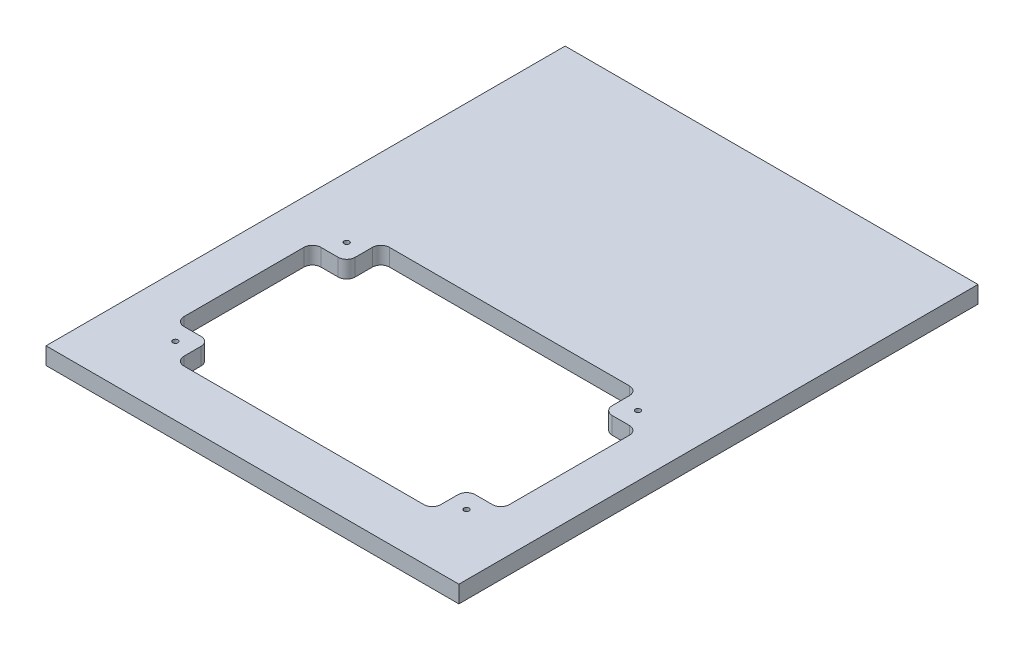
ISO-10303-21;
HEADER;
FILE_DESCRIPTION(('STEP AP214'),'2;1');
FILE_NAME('part.step','',(''),(''),'','','');
FILE_SCHEMA(('AUTOMOTIVE_DESIGN { 1 0 10303 214 1 1 1 1 }'));
ENDSEC;
DATA;
#1=APPLICATION_CONTEXT('core data for automotive mechanical design processes');
#2=APPLICATION_PROTOCOL_DEFINITION('international standard','automotive_design',2000,#1);
#3=PRODUCT_CONTEXT('',#1,'mechanical');
#4=PRODUCT('Part','Part','',(#3));
#5=PRODUCT_RELATED_PRODUCT_CATEGORY('part','',(#4));
#6=PRODUCT_DEFINITION_FORMATION('','',#4);
#7=PRODUCT_DEFINITION_CONTEXT('part definition',#1,'design');
#8=PRODUCT_DEFINITION('design','',#6,#7);
#9=PRODUCT_DEFINITION_SHAPE('','',#8);
#10=(LENGTH_UNIT() NAMED_UNIT(*) SI_UNIT(.MILLI.,.METRE.));
#11=(NAMED_UNIT(*) PLANE_ANGLE_UNIT() SI_UNIT($,.RADIAN.));
#12=(NAMED_UNIT(*) SI_UNIT($,.STERADIAN.) SOLID_ANGLE_UNIT());
#13=UNCERTAINTY_MEASURE_WITH_UNIT(LENGTH_MEASURE(1.E-05),#10,'distance_accuracy_value','');
#14=(GEOMETRIC_REPRESENTATION_CONTEXT(3) GLOBAL_UNCERTAINTY_ASSIGNED_CONTEXT((#13)) GLOBAL_UNIT_ASSIGNED_CONTEXT((#10,
#11,#12)) REPRESENTATION_CONTEXT('',''));
#15=CARTESIAN_POINT('',(0.,0.,0.));
#16=DIRECTION('',(0.,0.,1.));
#17=DIRECTION('',(1.,0.,0.));
#18=AXIS2_PLACEMENT_3D('',#15,#16,#17);
#19=CARTESIAN_POINT('',(0.,10.,0.));
#20=DIRECTION('',(1.,0.,0.));
#21=DIRECTION('',(0.,0.,-1.));
#22=AXIS2_PLACEMENT_3D('',#19,#20,#21);
#23=PLANE('',#22);
#24=DIRECTION('',(0.,0.,1.));
#25=VECTOR('',#24,1.);
#26=CARTESIAN_POINT('',(0.,0.,0.));
#27=LINE('',#26,#25);
#28=CARTESIAN_POINT('',(-1.11022302462516E-13,0.,-303.));
#29=VERTEX_POINT('',#28);
#30=CARTESIAN_POINT('',(0.,0.,0.));
#31=VERTEX_POINT('',#30);
#32=EDGE_CURVE('E378',#29,#31,#27,.T.);
#33=ORIENTED_EDGE('',*,*,#32,.T.);
#34=DIRECTION('',(0.,-1.,0.));
#35=VECTOR('',#34,1.);
#36=CARTESIAN_POINT('',(0.,10.,0.));
#37=LINE('',#36,#35);
#38=CARTESIAN_POINT('',(0.,10.,0.));
#39=VERTEX_POINT('',#38);
#40=EDGE_CURVE('E11',#39,#31,#37,.T.);
#41=ORIENTED_EDGE('',*,*,#40,.F.);
#42=DIRECTION('',(0.,0.,1.));
#43=VECTOR('',#42,1.);
#44=CARTESIAN_POINT('',(0.,10.,0.));
#45=LINE('',#44,#43);
#46=CARTESIAN_POINT('',(-1.11022302462516E-13,10.,-303.));
#47=VERTEX_POINT('',#46);
#48=EDGE_CURVE('E422',#47,#39,#45,.T.);
#49=ORIENTED_EDGE('',*,*,#48,.F.);
#50=DIRECTION('',(0.,-1.,0.));
#51=VECTOR('',#50,1.);
#52=CARTESIAN_POINT('',(-1.11022302462516E-13,10.,-303.));
#53=LINE('',#52,#51);
#54=EDGE_CURVE('E432',#47,#29,#53,.T.);
#55=ORIENTED_EDGE('',*,*,#54,.T.);
#56=EDGE_LOOP('',(#33,#41,#49,#55));
#57=FACE_BOUND('',#56,.T.);
#58=ADVANCED_FACE('F37',(#57),#23,.F.);
#59=CARTESIAN_POINT('',(0.,10.,0.));
#60=DIRECTION('',(0.,0.,-1.));
#61=DIRECTION('',(-1.,0.,0.));
#62=AXIS2_PLACEMENT_3D('',#59,#60,#61);
#63=PLANE('',#62);
#64=DIRECTION('',(1.,0.,0.));
#65=VECTOR('',#64,1.);
#66=CARTESIAN_POINT('',(0.,0.,0.));
#67=LINE('',#66,#65);
#68=CARTESIAN_POINT('',(241.,0.,0.));
#69=VERTEX_POINT('',#68);
#70=EDGE_CURVE('E435',#31,#69,#67,.T.);
#71=ORIENTED_EDGE('',*,*,#70,.T.);
#72=DIRECTION('',(0.,-1.,0.));
#73=VECTOR('',#72,1.);
#74=CARTESIAN_POINT('',(241.,10.,0.));
#75=LINE('',#74,#73);
#76=CARTESIAN_POINT('',(241.,10.,0.));
#77=VERTEX_POINT('',#76);
#78=EDGE_CURVE('E44',#77,#69,#75,.T.);
#79=ORIENTED_EDGE('',*,*,#78,.F.);
#80=DIRECTION('',(1.,0.,0.));
#81=VECTOR('',#80,1.);
#82=CARTESIAN_POINT('',(0.,10.,0.));
#83=LINE('',#82,#81);
#84=EDGE_CURVE('E425',#39,#77,#83,.T.);
#85=ORIENTED_EDGE('',*,*,#84,.F.);
#86=ORIENTED_EDGE('',*,*,#40,.T.);
#87=EDGE_LOOP('',(#71,#79,#85,#86));
#88=FACE_BOUND('',#87,.T.);
#89=ADVANCED_FACE('F463',(#88),#63,.F.);
#90=CARTESIAN_POINT('',(241.,10.,0.));
#91=DIRECTION('',(-1.,0.,0.));
#92=DIRECTION('',(0.,0.,1.));
#93=AXIS2_PLACEMENT_3D('',#90,#91,#92);
#94=PLANE('',#93);
#95=DIRECTION('',(0.,0.,-1.));
#96=VECTOR('',#95,1.);
#97=CARTESIAN_POINT('',(241.,0.,0.));
#98=LINE('',#97,#96);
#99=CARTESIAN_POINT('',(241.,0.,-303.));
#100=VERTEX_POINT('',#99);
#101=EDGE_CURVE('E437',#69,#100,#98,.T.);
#102=ORIENTED_EDGE('',*,*,#101,.T.);
#103=DIRECTION('',(0.,-1.,0.));
#104=VECTOR('',#103,1.);
#105=CARTESIAN_POINT('',(241.,10.,-303.));
#106=LINE('',#105,#104);
#107=CARTESIAN_POINT('',(241.,10.,-303.));
#108=VERTEX_POINT('',#107);
#109=EDGE_CURVE('E442',#108,#100,#106,.T.);
#110=ORIENTED_EDGE('',*,*,#109,.F.);
#111=DIRECTION('',(0.,0.,-1.));
#112=VECTOR('',#111,1.);
#113=CARTESIAN_POINT('',(241.,10.,0.));
#114=LINE('',#113,#112);
#115=EDGE_CURVE('E428',#77,#108,#114,.T.);
#116=ORIENTED_EDGE('',*,*,#115,.F.);
#117=ORIENTED_EDGE('',*,*,#78,.T.);
#118=EDGE_LOOP('',(#102,#110,#116,#117));
#119=FACE_BOUND('',#118,.T.);
#120=ADVANCED_FACE('F449',(#119),#94,.F.);
#121=CARTESIAN_POINT('',(-1.11022302462516E-13,10.,-303.));
#122=DIRECTION('',(0.,0.,1.));
#123=DIRECTION('',(1.,0.,0.));
#124=AXIS2_PLACEMENT_3D('',#121,#122,#123);
#125=PLANE('',#124);
#126=DIRECTION('',(-1.,0.,0.));
#127=VECTOR('',#126,1.);
#128=CARTESIAN_POINT('',(-1.11022302462516E-13,0.,-303.));
#129=LINE('',#128,#127);
#130=EDGE_CURVE('E426',#100,#29,#129,.T.);
#131=ORIENTED_EDGE('',*,*,#130,.T.);
#132=ORIENTED_EDGE('',*,*,#54,.F.);
#133=DIRECTION('',(-1.,0.,0.));
#134=VECTOR('',#133,1.);
#135=CARTESIAN_POINT('',(-1.11022302462516E-13,10.,-303.));
#136=LINE('',#135,#134);
#137=EDGE_CURVE('E430',#108,#47,#136,.T.);
#138=ORIENTED_EDGE('',*,*,#137,.F.);
#139=ORIENTED_EDGE('',*,*,#109,.T.);
#140=EDGE_LOOP('',(#131,#132,#138,#139));
#141=FACE_BOUND('',#140,.T.);
#142=ADVANCED_FACE('F456',(#141),#125,.F.);
#143=CARTESIAN_POINT('',(0.,10.,0.));
#144=DIRECTION('',(0.,-1.,0.));
#145=DIRECTION('',(0.,0.,-1.));
#146=AXIS2_PLACEMENT_3D('',#143,#144,#145);
#147=PLANE('',#146);
#148=CARTESIAN_POINT('',(205.5,10.,-40.));
#149=DIRECTION('',(0.,1.,0.));
#150=DIRECTION('',(0.,0.,1.));
#151=AXIS2_PLACEMENT_3D('',#148,#149,#150);
#152=CIRCLE('',#151,1.5);
#153=CARTESIAN_POINT('',(205.5,10.,-38.5));
#154=VERTEX_POINT('',#153);
#155=EDGE_CURVE('E607',#154,#154,#152,.T.);
#156=ORIENTED_EDGE('',*,*,#155,.F.);
#157=EDGE_LOOP('',(#156));
#158=FACE_BOUND('',#157,.T.);
#159=CARTESIAN_POINT('',(35.4999999999999,10.,-40.));
#160=DIRECTION('',(0.,1.,0.));
#161=DIRECTION('',(0.,0.,1.));
#162=AXIS2_PLACEMENT_3D('',#159,#160,#161);
#163=CIRCLE('',#162,1.5);
#164=CARTESIAN_POINT('',(35.4999999999999,10.,-38.5));
#165=VERTEX_POINT('',#164);
#166=EDGE_CURVE('E599',#165,#165,#163,.T.);
#167=ORIENTED_EDGE('',*,*,#166,.F.);
#168=EDGE_LOOP('',(#167));
#169=FACE_BOUND('',#168,.T.);
#170=CARTESIAN_POINT('',(35.4999999999999,10.,-140.));
#171=DIRECTION('',(0.,1.,0.));
#172=DIRECTION('',(0.,0.,1.));
#173=AXIS2_PLACEMENT_3D('',#170,#171,#172);
#174=CIRCLE('',#173,1.5);
#175=CARTESIAN_POINT('',(35.4999999999999,10.,-138.5));
#176=VERTEX_POINT('',#175);
#177=EDGE_CURVE('E593',#176,#176,#174,.T.);
#178=ORIENTED_EDGE('',*,*,#177,.F.);
#179=EDGE_LOOP('',(#178));
#180=FACE_BOUND('',#179,.T.);
#181=CARTESIAN_POINT('',(205.5,10.,-140.));
#182=DIRECTION('',(0.,1.,0.));
#183=DIRECTION('',(0.,0.,1.));
#184=AXIS2_PLACEMENT_3D('',#181,#182,#183);
#185=CIRCLE('',#184,1.5);
#186=CARTESIAN_POINT('',(205.5,10.,-138.5));
#187=VERTEX_POINT('',#186);
#188=EDGE_CURVE('E246',#187,#187,#185,.T.);
#189=ORIENTED_EDGE('',*,*,#188,.F.);
#190=EDGE_LOOP('',(#189));
#191=FACE_BOUND('',#190,.T.);
#192=DIRECTION('',(0.,0.,1.));
#193=VECTOR('',#192,1.);
#194=CARTESIAN_POINT('',(45.4999999999999,10.,-145.));
#195=LINE('',#194,#193);
#196=CARTESIAN_POINT('',(45.4999999999999,10.,-145.));
#197=VERTEX_POINT('',#196);
#198=CARTESIAN_POINT('',(45.5,10.,-135.));
#199=VERTEX_POINT('',#198);
#200=EDGE_CURVE('E311',#197,#199,#195,.T.);
#201=ORIENTED_EDGE('',*,*,#200,.F.);
#202=CARTESIAN_POINT('',(50.4999999999999,10.,-145.));
#203=DIRECTION('',(0.,1.,0.));
#204=DIRECTION('',(0.,0.,1.));
#205=AXIS2_PLACEMENT_3D('',#202,#203,#204);
#206=CIRCLE('',#205,5.);
#207=CARTESIAN_POINT('',(50.4999999999999,10.,-150.));
#208=VERTEX_POINT('',#207);
#209=EDGE_CURVE('E51',#208,#197,#206,.T.);
#210=ORIENTED_EDGE('',*,*,#209,.F.);
#211=DIRECTION('',(-1.,0.,0.));
#212=VECTOR('',#211,1.);
#213=CARTESIAN_POINT('',(50.4999999999999,10.,-150.));
#214=LINE('',#213,#212);
#215=CARTESIAN_POINT('',(190.5,10.,-150.));
#216=VERTEX_POINT('',#215);
#217=EDGE_CURVE('E240',#216,#208,#214,.T.);
#218=ORIENTED_EDGE('',*,*,#217,.F.);
#219=CARTESIAN_POINT('',(190.5,10.,-145.));
#220=DIRECTION('',(0.,1.,0.));
#221=DIRECTION('',(0.,0.,-1.));
#222=AXIS2_PLACEMENT_3D('',#219,#220,#221);
#223=CIRCLE('',#222,5.);
#224=CARTESIAN_POINT('',(195.5,10.,-145.));
#225=VERTEX_POINT('',#224);
#226=EDGE_CURVE('E243',#225,#216,#223,.T.);
#227=ORIENTED_EDGE('',*,*,#226,.F.);
#228=DIRECTION('',(0.,0.,-1.));
#229=VECTOR('',#228,1.);
#230=CARTESIAN_POINT('',(195.5,10.,-145.));
#231=LINE('',#230,#229);
#232=CARTESIAN_POINT('',(195.5,10.,-135.));
#233=VERTEX_POINT('',#232);
#234=EDGE_CURVE('E371',#233,#225,#231,.T.);
#235=ORIENTED_EDGE('',*,*,#234,.F.);
#236=CARTESIAN_POINT('',(200.5,10.,-135.));
#237=DIRECTION('',(0.,-1.,0.));
#238=DIRECTION('',(0.,0.,-1.));
#239=AXIS2_PLACEMENT_3D('',#236,#237,#238);
#240=CIRCLE('',#239,5.);
#241=CARTESIAN_POINT('',(200.5,10.,-130.));
#242=VERTEX_POINT('',#241);
#243=EDGE_CURVE('E368',#242,#233,#240,.T.);
#244=ORIENTED_EDGE('',*,*,#243,.F.);
#245=DIRECTION('',(-1.,0.,0.));
#246=VECTOR('',#245,1.);
#247=CARTESIAN_POINT('',(210.5,10.,-130.));
#248=LINE('',#247,#246);
#249=CARTESIAN_POINT('',(210.5,10.,-130.));
#250=VERTEX_POINT('',#249);
#251=EDGE_CURVE('E365',#250,#242,#248,.T.);
#252=ORIENTED_EDGE('',*,*,#251,.F.);
#253=CARTESIAN_POINT('',(210.5,10.,-125.));
#254=DIRECTION('',(0.,1.,0.));
#255=DIRECTION('',(0.,0.,1.));
#256=AXIS2_PLACEMENT_3D('',#253,#254,#255);
#257=CIRCLE('',#256,5.);
#258=CARTESIAN_POINT('',(215.5,10.,-125.));
#259=VERTEX_POINT('',#258);
#260=EDGE_CURVE('E362',#259,#250,#257,.T.);
#261=ORIENTED_EDGE('',*,*,#260,.F.);
#262=DIRECTION('',(0.,0.,-1.));
#263=VECTOR('',#262,1.);
#264=CARTESIAN_POINT('',(215.5,10.,-55.));
#265=LINE('',#264,#263);
#266=CARTESIAN_POINT('',(215.5,10.,-55.));
#267=VERTEX_POINT('',#266);
#268=EDGE_CURVE('E359',#267,#259,#265,.T.);
#269=ORIENTED_EDGE('',*,*,#268,.F.);
#270=CARTESIAN_POINT('',(210.5,10.,-55.));
#271=DIRECTION('',(0.,1.,0.));
#272=DIRECTION('',(0.,0.,1.));
#273=AXIS2_PLACEMENT_3D('',#270,#271,#272);
#274=CIRCLE('',#273,5.);
#275=CARTESIAN_POINT('',(210.5,10.,-50.));
#276=VERTEX_POINT('',#275);
#277=EDGE_CURVE('E356',#276,#267,#274,.T.);
#278=ORIENTED_EDGE('',*,*,#277,.F.);
#279=DIRECTION('',(1.,0.,0.));
#280=VECTOR('',#279,1.);
#281=CARTESIAN_POINT('',(210.5,10.,-50.));
#282=LINE('',#281,#280);
#283=CARTESIAN_POINT('',(200.5,10.,-50.));
#284=VERTEX_POINT('',#283);
#285=EDGE_CURVE('E353',#284,#276,#282,.T.);
#286=ORIENTED_EDGE('',*,*,#285,.F.);
#287=CARTESIAN_POINT('',(200.5,10.,-45.));
#288=DIRECTION('',(0.,-1.,0.));
#289=DIRECTION('',(0.,0.,1.));
#290=AXIS2_PLACEMENT_3D('',#287,#288,#289);
#291=CIRCLE('',#290,5.00000000000002);
#292=CARTESIAN_POINT('',(195.5,10.,-45.));
#293=VERTEX_POINT('',#292);
#294=EDGE_CURVE('E350',#293,#284,#291,.T.);
#295=ORIENTED_EDGE('',*,*,#294,.F.);
#296=DIRECTION('',(0.,0.,-1.));
#297=VECTOR('',#296,1.);
#298=CARTESIAN_POINT('',(195.5,10.,-45.));
#299=LINE('',#298,#297);
#300=CARTESIAN_POINT('',(195.5,10.,-35.));
#301=VERTEX_POINT('',#300);
#302=EDGE_CURVE('E347',#301,#293,#299,.T.);
#303=ORIENTED_EDGE('',*,*,#302,.F.);
#304=CARTESIAN_POINT('',(190.5,10.,-35.));
#305=DIRECTION('',(0.,1.,0.));
#306=DIRECTION('',(0.,0.,1.));
#307=AXIS2_PLACEMENT_3D('',#304,#305,#306);
#308=CIRCLE('',#307,5.);
#309=CARTESIAN_POINT('',(190.5,10.,-30.));
#310=VERTEX_POINT('',#309);
#311=EDGE_CURVE('E344',#310,#301,#308,.T.);
#312=ORIENTED_EDGE('',*,*,#311,.F.);
#313=DIRECTION('',(1.,0.,0.));
#314=VECTOR('',#313,1.);
#315=CARTESIAN_POINT('',(50.4999999999999,10.,-30.));
#316=LINE('',#315,#314);
#317=CARTESIAN_POINT('',(50.4999999999999,10.,-30.));
#318=VERTEX_POINT('',#317);
#319=EDGE_CURVE('E341',#318,#310,#316,.T.);
#320=ORIENTED_EDGE('',*,*,#319,.F.);
#321=CARTESIAN_POINT('',(50.4999999999999,10.,-35.));
#322=DIRECTION('',(0.,1.,0.));
#323=DIRECTION('',(0.,0.,-1.));
#324=AXIS2_PLACEMENT_3D('',#321,#322,#323);
#325=CIRCLE('',#324,5.);
#326=CARTESIAN_POINT('',(45.4999999999999,10.,-35.));
#327=VERTEX_POINT('',#326);
#328=EDGE_CURVE('E338',#327,#318,#325,.T.);
#329=ORIENTED_EDGE('',*,*,#328,.F.);
#330=DIRECTION('',(0.,0.,1.));
#331=VECTOR('',#330,1.);
#332=CARTESIAN_POINT('',(45.4999999999999,10.,-45.));
#333=LINE('',#332,#331);
#334=CARTESIAN_POINT('',(45.4999999999999,10.,-45.));
#335=VERTEX_POINT('',#334);
#336=EDGE_CURVE('E335',#335,#327,#333,.T.);
#337=ORIENTED_EDGE('',*,*,#336,.F.);
#338=CARTESIAN_POINT('',(40.4999999999999,10.,-45.));
#339=DIRECTION('',(0.,-1.,0.));
#340=DIRECTION('',(0.,0.,-1.));
#341=AXIS2_PLACEMENT_3D('',#338,#339,#340);
#342=CIRCLE('',#341,4.99999999999999);
#343=CARTESIAN_POINT('',(40.4999999999999,10.,-50.));
#344=VERTEX_POINT('',#343);
#345=EDGE_CURVE('E332',#344,#335,#342,.T.);
#346=ORIENTED_EDGE('',*,*,#345,.F.);
#347=DIRECTION('',(1.,0.,0.));
#348=VECTOR('',#347,1.);
#349=CARTESIAN_POINT('',(30.4999999999999,10.,-50.));
#350=LINE('',#349,#348);
#351=CARTESIAN_POINT('',(30.4999999999999,10.,-50.));
#352=VERTEX_POINT('',#351);
#353=EDGE_CURVE('E329',#352,#344,#350,.T.);
#354=ORIENTED_EDGE('',*,*,#353,.F.);
#355=CARTESIAN_POINT('',(30.4999999999999,10.,-55.));
#356=DIRECTION('',(0.,1.,0.));
#357=DIRECTION('',(0.,0.,-1.));
#358=AXIS2_PLACEMENT_3D('',#355,#356,#357);
#359=CIRCLE('',#358,5.);
#360=CARTESIAN_POINT('',(25.4999999999999,10.,-55.));
#361=VERTEX_POINT('',#360);
#362=EDGE_CURVE('E326',#361,#352,#359,.T.);
#363=ORIENTED_EDGE('',*,*,#362,.F.);
#364=DIRECTION('',(0.,0.,1.));
#365=VECTOR('',#364,1.);
#366=CARTESIAN_POINT('',(25.4999999999999,10.,-55.));
#367=LINE('',#366,#365);
#368=CARTESIAN_POINT('',(25.4999999999999,10.,-125.));
#369=VERTEX_POINT('',#368);
#370=EDGE_CURVE('E323',#369,#361,#367,.T.);
#371=ORIENTED_EDGE('',*,*,#370,.F.);
#372=CARTESIAN_POINT('',(30.4999999999999,10.,-125.));
#373=DIRECTION('',(0.,1.,0.));
#374=DIRECTION('',(0.,0.,-1.));
#375=AXIS2_PLACEMENT_3D('',#372,#373,#374);
#376=CIRCLE('',#375,5.);
#377=CARTESIAN_POINT('',(30.4999999999999,10.,-130.));
#378=VERTEX_POINT('',#377);
#379=EDGE_CURVE('E320',#378,#369,#376,.T.);
#380=ORIENTED_EDGE('',*,*,#379,.F.);
#381=DIRECTION('',(-1.,0.,0.));
#382=VECTOR('',#381,1.);
#383=CARTESIAN_POINT('',(30.4999999999999,10.,-130.));
#384=LINE('',#383,#382);
#385=CARTESIAN_POINT('',(40.4999999999999,10.,-130.));
#386=VERTEX_POINT('',#385);
#387=EDGE_CURVE('E317',#386,#378,#384,.T.);
#388=ORIENTED_EDGE('',*,*,#387,.F.);
#389=CARTESIAN_POINT('',(40.4999999999999,10.,-135.));
#390=DIRECTION('',(0.,-1.,0.));
#391=DIRECTION('',(0.,0.,1.));
#392=AXIS2_PLACEMENT_3D('',#389,#390,#391);
#393=CIRCLE('',#392,5.00000000000002);
#394=EDGE_CURVE('E314',#199,#386,#393,.T.);
#395=ORIENTED_EDGE('',*,*,#394,.F.);
#396=EDGE_LOOP('',(#201,#210,#218,#227,#235,#244,#252,#261,#269,#278,#286,#295,#303,#312,#320,
#329,#337,#346,#354,#363,#371,#380,#388,#395));
#397=FACE_BOUND('',#396,.T.);
#398=ORIENTED_EDGE('',*,*,#48,.T.);
#399=ORIENTED_EDGE('',*,*,#84,.T.);
#400=ORIENTED_EDGE('',*,*,#115,.T.);
#401=ORIENTED_EDGE('',*,*,#137,.T.);
#402=EDGE_LOOP('',(#398,#399,#400,#401));
#403=FACE_BOUND('',#402,.T.);
#404=ADVANCED_FACE('F462',(#158,#169,#180,#191,#397,#403),#147,.F.);
#405=CARTESIAN_POINT('',(0.,0.,0.));
#406=DIRECTION('',(0.,-1.,0.));
#407=DIRECTION('',(0.,0.,-1.));
#408=AXIS2_PLACEMENT_3D('',#405,#406,#407);
#409=PLANE('',#408);
#410=CARTESIAN_POINT('',(205.5,0.,-40.));
#411=DIRECTION('',(0.,1.,0.));
#412=DIRECTION('',(0.,0.,1.));
#413=AXIS2_PLACEMENT_3D('',#410,#411,#412);
#414=CIRCLE('',#413,1.5);
#415=CARTESIAN_POINT('',(205.5,0.,-38.5));
#416=VERTEX_POINT('',#415);
#417=EDGE_CURVE('E604',#416,#416,#414,.T.);
#418=ORIENTED_EDGE('',*,*,#417,.T.);
#419=EDGE_LOOP('',(#418));
#420=FACE_BOUND('',#419,.T.);
#421=CARTESIAN_POINT('',(35.4999999999999,0.,-40.));
#422=DIRECTION('',(0.,1.,0.));
#423=DIRECTION('',(0.,0.,1.));
#424=AXIS2_PLACEMENT_3D('',#421,#422,#423);
#425=CIRCLE('',#424,1.5);
#426=CARTESIAN_POINT('',(35.4999999999999,0.,-38.5));
#427=VERTEX_POINT('',#426);
#428=EDGE_CURVE('E595',#427,#427,#425,.T.);
#429=ORIENTED_EDGE('',*,*,#428,.T.);
#430=EDGE_LOOP('',(#429));
#431=FACE_BOUND('',#430,.T.);
#432=CARTESIAN_POINT('',(35.4999999999999,0.,-140.));
#433=DIRECTION('',(0.,1.,0.));
#434=DIRECTION('',(0.,0.,1.));
#435=AXIS2_PLACEMENT_3D('',#432,#433,#434);
#436=CIRCLE('',#435,1.5);
#437=CARTESIAN_POINT('',(35.4999999999999,0.,-138.5));
#438=VERTEX_POINT('',#437);
#439=EDGE_CURVE('E590',#438,#438,#436,.T.);
#440=ORIENTED_EDGE('',*,*,#439,.T.);
#441=EDGE_LOOP('',(#440));
#442=FACE_BOUND('',#441,.T.);
#443=CARTESIAN_POINT('',(205.5,0.,-140.));
#444=DIRECTION('',(0.,1.,0.));
#445=DIRECTION('',(0.,0.,1.));
#446=AXIS2_PLACEMENT_3D('',#443,#444,#445);
#447=CIRCLE('',#446,1.5);
#448=CARTESIAN_POINT('',(205.5,0.,-138.5));
#449=VERTEX_POINT('',#448);
#450=EDGE_CURVE('E312',#449,#449,#447,.T.);
#451=ORIENTED_EDGE('',*,*,#450,.T.);
#452=EDGE_LOOP('',(#451));
#453=FACE_BOUND('',#452,.T.);
#454=CARTESIAN_POINT('',(50.4999999999999,0.,-145.));
#455=DIRECTION('',(0.,1.,0.));
#456=DIRECTION('',(0.,0.,1.));
#457=AXIS2_PLACEMENT_3D('',#454,#455,#456);
#458=CIRCLE('',#457,5.);
#459=CARTESIAN_POINT('',(50.4999999999999,0.,-150.));
#460=VERTEX_POINT('',#459);
#461=CARTESIAN_POINT('',(45.4999999999999,0.,-145.));
#462=VERTEX_POINT('',#461);
#463=EDGE_CURVE('E223',#460,#462,#458,.T.);
#464=ORIENTED_EDGE('',*,*,#463,.T.);
#465=DIRECTION('',(0.,0.,1.));
#466=VECTOR('',#465,1.);
#467=CARTESIAN_POINT('',(45.4999999999999,0.,-145.));
#468=LINE('',#467,#466);
#469=CARTESIAN_POINT('',(45.4999999999999,0.,-135.));
#470=VERTEX_POINT('',#469);
#471=EDGE_CURVE('E232',#462,#470,#468,.T.);
#472=ORIENTED_EDGE('',*,*,#471,.T.);
#473=CARTESIAN_POINT('',(40.4999999999999,0.,-135.));
#474=DIRECTION('',(0.,-1.,0.));
#475=DIRECTION('',(0.,0.,1.));
#476=AXIS2_PLACEMENT_3D('',#473,#474,#475);
#477=CIRCLE('',#476,5.00000000000002);
#478=CARTESIAN_POINT('',(40.4999999999999,0.,-130.));
#479=VERTEX_POINT('',#478);
#480=EDGE_CURVE('E59',#470,#479,#477,.T.);
#481=ORIENTED_EDGE('',*,*,#480,.T.);
#482=DIRECTION('',(-1.,0.,0.));
#483=VECTOR('',#482,1.);
#484=CARTESIAN_POINT('',(30.4999999999999,0.,-130.));
#485=LINE('',#484,#483);
#486=CARTESIAN_POINT('',(30.4999999999999,0.,-130.));
#487=VERTEX_POINT('',#486);
#488=EDGE_CURVE('E250',#479,#487,#485,.T.);
#489=ORIENTED_EDGE('',*,*,#488,.T.);
#490=CARTESIAN_POINT('',(30.4999999999999,0.,-125.));
#491=DIRECTION('',(0.,1.,0.));
#492=DIRECTION('',(0.,0.,-1.));
#493=AXIS2_PLACEMENT_3D('',#490,#491,#492);
#494=CIRCLE('',#493,5.);
#495=CARTESIAN_POINT('',(25.4999999999999,0.,-125.));
#496=VERTEX_POINT('',#495);
#497=EDGE_CURVE('E253',#487,#496,#494,.T.);
#498=ORIENTED_EDGE('',*,*,#497,.T.);
#499=DIRECTION('',(0.,0.,1.));
#500=VECTOR('',#499,1.);
#501=CARTESIAN_POINT('',(25.4999999999999,0.,-55.));
#502=LINE('',#501,#500);
#503=CARTESIAN_POINT('',(25.4999999999999,0.,-55.));
#504=VERTEX_POINT('',#503);
#505=EDGE_CURVE('E256',#496,#504,#502,.T.);
#506=ORIENTED_EDGE('',*,*,#505,.T.);
#507=CARTESIAN_POINT('',(30.4999999999999,0.,-55.));
#508=DIRECTION('',(0.,1.,0.));
#509=DIRECTION('',(0.,0.,-1.));
#510=AXIS2_PLACEMENT_3D('',#507,#508,#509);
#511=CIRCLE('',#510,5.);
#512=CARTESIAN_POINT('',(30.4999999999999,0.,-50.));
#513=VERTEX_POINT('',#512);
#514=EDGE_CURVE('E259',#504,#513,#511,.T.);
#515=ORIENTED_EDGE('',*,*,#514,.T.);
#516=DIRECTION('',(1.,0.,0.));
#517=VECTOR('',#516,1.);
#518=CARTESIAN_POINT('',(30.4999999999999,0.,-50.));
#519=LINE('',#518,#517);
#520=CARTESIAN_POINT('',(40.4999999999999,0.,-50.));
#521=VERTEX_POINT('',#520);
#522=EDGE_CURVE('E262',#513,#521,#519,.T.);
#523=ORIENTED_EDGE('',*,*,#522,.T.);
#524=CARTESIAN_POINT('',(40.4999999999999,0.,-45.));
#525=DIRECTION('',(0.,-1.,0.));
#526=DIRECTION('',(0.,0.,-1.));
#527=AXIS2_PLACEMENT_3D('',#524,#525,#526);
#528=CIRCLE('',#527,4.99999999999999);
#529=CARTESIAN_POINT('',(45.4999999999999,0.,-45.));
#530=VERTEX_POINT('',#529);
#531=EDGE_CURVE('E265',#521,#530,#528,.T.);
#532=ORIENTED_EDGE('',*,*,#531,.T.);
#533=DIRECTION('',(0.,0.,1.));
#534=VECTOR('',#533,1.);
#535=CARTESIAN_POINT('',(45.4999999999999,0.,-45.));
#536=LINE('',#535,#534);
#537=CARTESIAN_POINT('',(45.4999999999999,0.,-35.));
#538=VERTEX_POINT('',#537);
#539=EDGE_CURVE('E268',#530,#538,#536,.T.);
#540=ORIENTED_EDGE('',*,*,#539,.T.);
#541=CARTESIAN_POINT('',(50.4999999999999,0.,-35.));
#542=DIRECTION('',(0.,1.,0.));
#543=DIRECTION('',(0.,0.,-1.));
#544=AXIS2_PLACEMENT_3D('',#541,#542,#543);
#545=CIRCLE('',#544,5.);
#546=CARTESIAN_POINT('',(50.4999999999999,0.,-30.));
#547=VERTEX_POINT('',#546);
#548=EDGE_CURVE('E271',#538,#547,#545,.T.);
#549=ORIENTED_EDGE('',*,*,#548,.T.);
#550=DIRECTION('',(1.,0.,0.));
#551=VECTOR('',#550,1.);
#552=CARTESIAN_POINT('',(50.4999999999999,0.,-30.));
#553=LINE('',#552,#551);
#554=CARTESIAN_POINT('',(190.5,0.,-30.));
#555=VERTEX_POINT('',#554);
#556=EDGE_CURVE('E274',#547,#555,#553,.T.);
#557=ORIENTED_EDGE('',*,*,#556,.T.);
#558=CARTESIAN_POINT('',(190.5,0.,-35.));
#559=DIRECTION('',(0.,1.,0.));
#560=DIRECTION('',(0.,0.,1.));
#561=AXIS2_PLACEMENT_3D('',#558,#559,#560);
#562=CIRCLE('',#561,5.);
#563=CARTESIAN_POINT('',(195.5,0.,-35.));
#564=VERTEX_POINT('',#563);
#565=EDGE_CURVE('E277',#555,#564,#562,.T.);
#566=ORIENTED_EDGE('',*,*,#565,.T.);
#567=DIRECTION('',(0.,0.,-1.));
#568=VECTOR('',#567,1.);
#569=CARTESIAN_POINT('',(195.5,0.,-45.));
#570=LINE('',#569,#568);
#571=CARTESIAN_POINT('',(195.5,0.,-45.));
#572=VERTEX_POINT('',#571);
#573=EDGE_CURVE('E280',#564,#572,#570,.T.);
#574=ORIENTED_EDGE('',*,*,#573,.T.);
#575=CARTESIAN_POINT('',(200.5,0.,-45.));
#576=DIRECTION('',(0.,-1.,0.));
#577=DIRECTION('',(0.,0.,1.));
#578=AXIS2_PLACEMENT_3D('',#575,#576,#577);
#579=CIRCLE('',#578,5.00000000000002);
#580=CARTESIAN_POINT('',(200.5,0.,-50.));
#581=VERTEX_POINT('',#580);
#582=EDGE_CURVE('E283',#572,#581,#579,.T.);
#583=ORIENTED_EDGE('',*,*,#582,.T.);
#584=DIRECTION('',(1.,0.,0.));
#585=VECTOR('',#584,1.);
#586=CARTESIAN_POINT('',(210.5,0.,-50.));
#587=LINE('',#586,#585);
#588=CARTESIAN_POINT('',(210.5,0.,-50.));
#589=VERTEX_POINT('',#588);
#590=EDGE_CURVE('E286',#581,#589,#587,.T.);
#591=ORIENTED_EDGE('',*,*,#590,.T.);
#592=CARTESIAN_POINT('',(210.5,0.,-55.));
#593=DIRECTION('',(0.,1.,0.));
#594=DIRECTION('',(0.,0.,1.));
#595=AXIS2_PLACEMENT_3D('',#592,#593,#594);
#596=CIRCLE('',#595,5.);
#597=CARTESIAN_POINT('',(215.5,0.,-55.));
#598=VERTEX_POINT('',#597);
#599=EDGE_CURVE('E289',#589,#598,#596,.T.);
#600=ORIENTED_EDGE('',*,*,#599,.T.);
#601=DIRECTION('',(0.,0.,-1.));
#602=VECTOR('',#601,1.);
#603=CARTESIAN_POINT('',(215.5,0.,-55.));
#604=LINE('',#603,#602);
#605=CARTESIAN_POINT('',(215.5,0.,-125.));
#606=VERTEX_POINT('',#605);
#607=EDGE_CURVE('E292',#598,#606,#604,.T.);
#608=ORIENTED_EDGE('',*,*,#607,.T.);
#609=CARTESIAN_POINT('',(210.5,0.,-125.));
#610=DIRECTION('',(0.,1.,0.));
#611=DIRECTION('',(0.,0.,1.));
#612=AXIS2_PLACEMENT_3D('',#609,#610,#611);
#613=CIRCLE('',#612,5.);
#614=CARTESIAN_POINT('',(210.5,0.,-130.));
#615=VERTEX_POINT('',#614);
#616=EDGE_CURVE('E295',#606,#615,#613,.T.);
#617=ORIENTED_EDGE('',*,*,#616,.T.);
#618=DIRECTION('',(-1.,0.,0.));
#619=VECTOR('',#618,1.);
#620=CARTESIAN_POINT('',(210.5,0.,-130.));
#621=LINE('',#620,#619);
#622=CARTESIAN_POINT('',(200.5,0.,-130.));
#623=VERTEX_POINT('',#622);
#624=EDGE_CURVE('E298',#615,#623,#621,.T.);
#625=ORIENTED_EDGE('',*,*,#624,.T.);
#626=CARTESIAN_POINT('',(200.5,0.,-135.));
#627=DIRECTION('',(0.,-1.,0.));
#628=DIRECTION('',(0.,0.,-1.));
#629=AXIS2_PLACEMENT_3D('',#626,#627,#628);
#630=CIRCLE('',#629,5.);
#631=CARTESIAN_POINT('',(195.5,0.,-135.));
#632=VERTEX_POINT('',#631);
#633=EDGE_CURVE('E301',#623,#632,#630,.T.);
#634=ORIENTED_EDGE('',*,*,#633,.T.);
#635=DIRECTION('',(0.,0.,-1.));
#636=VECTOR('',#635,1.);
#637=CARTESIAN_POINT('',(195.5,0.,-145.));
#638=LINE('',#637,#636);
#639=CARTESIAN_POINT('',(195.5,0.,-145.));
#640=VERTEX_POINT('',#639);
#641=EDGE_CURVE('E304',#632,#640,#638,.T.);
#642=ORIENTED_EDGE('',*,*,#641,.T.);
#643=CARTESIAN_POINT('',(190.5,0.,-145.));
#644=DIRECTION('',(0.,1.,0.));
#645=DIRECTION('',(0.,0.,-1.));
#646=AXIS2_PLACEMENT_3D('',#643,#644,#645);
#647=CIRCLE('',#646,5.);
#648=CARTESIAN_POINT('',(190.5,0.,-150.));
#649=VERTEX_POINT('',#648);
#650=EDGE_CURVE('E307',#640,#649,#647,.T.);
#651=ORIENTED_EDGE('',*,*,#650,.T.);
#652=DIRECTION('',(-1.,0.,0.));
#653=VECTOR('',#652,1.);
#654=CARTESIAN_POINT('',(50.4999999999999,0.,-150.));
#655=LINE('',#654,#653);
#656=EDGE_CURVE('E229',#649,#460,#655,.T.);
#657=ORIENTED_EDGE('',*,*,#656,.T.);
#658=EDGE_LOOP('',(#464,#472,#481,#489,#498,#506,#515,#523,#532,#540,#549,#557,#566,#574,#583,
#591,#600,#608,#617,#625,#634,#642,#651,#657));
#659=FACE_BOUND('',#658,.T.);
#660=ORIENTED_EDGE('',*,*,#32,.F.);
#661=ORIENTED_EDGE('',*,*,#130,.F.);
#662=ORIENTED_EDGE('',*,*,#101,.F.);
#663=ORIENTED_EDGE('',*,*,#70,.F.);
#664=EDGE_LOOP('',(#660,#661,#662,#663));
#665=FACE_BOUND('',#664,.T.);
#666=ADVANCED_FACE('F236',(#420,#431,#442,#453,#659,#665),#409,.T.);
#667=CARTESIAN_POINT('',(50.4999999999999,0.,-145.));
#668=DIRECTION('',(0.,1.,0.));
#669=DIRECTION('',(0.,0.,1.));
#670=AXIS2_PLACEMENT_3D('',#667,#668,#669);
#671=CYLINDRICAL_SURFACE('',#670,5.);
#672=ORIENTED_EDGE('',*,*,#209,.T.);
#673=DIRECTION('',(0.,1.,0.));
#674=VECTOR('',#673,1.);
#675=CARTESIAN_POINT('',(45.4999999999999,0.,-145.));
#676=LINE('',#675,#674);
#677=EDGE_CURVE('E219',#462,#197,#676,.T.);
#678=ORIENTED_EDGE('',*,*,#677,.F.);
#679=ORIENTED_EDGE('',*,*,#463,.F.);
#680=DIRECTION('',(0.,1.,0.));
#681=VECTOR('',#680,1.);
#682=CARTESIAN_POINT('',(50.4999999999999,0.,-150.));
#683=LINE('',#682,#681);
#684=EDGE_CURVE('E376',#460,#208,#683,.T.);
#685=ORIENTED_EDGE('',*,*,#684,.T.);
#686=EDGE_LOOP('',(#672,#678,#679,#685));
#687=FACE_BOUND('',#686,.T.);
#688=ADVANCED_FACE('F221',(#687),#671,.F.);
#689=CARTESIAN_POINT('',(50.4999999999999,0.,-150.));
#690=DIRECTION('',(0.,0.,-1.));
#691=DIRECTION('',(-1.,0.,0.));
#692=AXIS2_PLACEMENT_3D('',#689,#690,#691);
#693=PLANE('',#692);
#694=ORIENTED_EDGE('',*,*,#217,.T.);
#695=ORIENTED_EDGE('',*,*,#684,.F.);
#696=ORIENTED_EDGE('',*,*,#656,.F.);
#697=DIRECTION('',(0.,1.,0.));
#698=VECTOR('',#697,1.);
#699=CARTESIAN_POINT('',(190.5,0.,-150.));
#700=LINE('',#699,#698);
#701=EDGE_CURVE('E379',#649,#216,#700,.T.);
#702=ORIENTED_EDGE('',*,*,#701,.T.);
#703=EDGE_LOOP('',(#694,#695,#696,#702));
#704=FACE_BOUND('',#703,.T.);
#705=ADVANCED_FACE('F481',(#704),#693,.F.);
#706=CARTESIAN_POINT('',(190.5,0.,-145.));
#707=DIRECTION('',(0.,1.,0.));
#708=DIRECTION('',(0.,0.,1.));
#709=AXIS2_PLACEMENT_3D('',#706,#707,#708);
#710=CYLINDRICAL_SURFACE('',#709,5.);
#711=ORIENTED_EDGE('',*,*,#226,.T.);
#712=ORIENTED_EDGE('',*,*,#701,.F.);
#713=ORIENTED_EDGE('',*,*,#650,.F.);
#714=DIRECTION('',(0.,1.,0.));
#715=VECTOR('',#714,1.);
#716=CARTESIAN_POINT('',(195.5,0.,-145.));
#717=LINE('',#716,#715);
#718=EDGE_CURVE('E381',#640,#225,#717,.T.);
#719=ORIENTED_EDGE('',*,*,#718,.T.);
#720=EDGE_LOOP('',(#711,#712,#713,#719));
#721=FACE_BOUND('',#720,.T.);
#722=ADVANCED_FACE('F563',(#721),#710,.F.);
#723=CARTESIAN_POINT('',(195.5,0.,-145.));
#724=DIRECTION('',(1.,0.,0.));
#725=DIRECTION('',(0.,0.,-1.));
#726=AXIS2_PLACEMENT_3D('',#723,#724,#725);
#727=PLANE('',#726);
#728=ORIENTED_EDGE('',*,*,#234,.T.);
#729=ORIENTED_EDGE('',*,*,#718,.F.);
#730=ORIENTED_EDGE('',*,*,#641,.F.);
#731=DIRECTION('',(0.,1.,0.));
#732=VECTOR('',#731,1.);
#733=CARTESIAN_POINT('',(195.5,0.,-135.));
#734=LINE('',#733,#732);
#735=EDGE_CURVE('E383',#632,#233,#734,.T.);
#736=ORIENTED_EDGE('',*,*,#735,.T.);
#737=EDGE_LOOP('',(#728,#729,#730,#736));
#738=FACE_BOUND('',#737,.T.);
#739=ADVANCED_FACE('F559',(#738),#727,.F.);
#740=CARTESIAN_POINT('',(200.5,0.,-135.));
#741=DIRECTION('',(0.,1.,0.));
#742=DIRECTION('',(0.,0.,1.));
#743=AXIS2_PLACEMENT_3D('',#740,#741,#742);
#744=CYLINDRICAL_SURFACE('',#743,5.);
#745=ORIENTED_EDGE('',*,*,#243,.T.);
#746=ORIENTED_EDGE('',*,*,#735,.F.);
#747=ORIENTED_EDGE('',*,*,#633,.F.);
#748=DIRECTION('',(0.,1.,0.));
#749=VECTOR('',#748,1.);
#750=CARTESIAN_POINT('',(200.5,0.,-130.));
#751=LINE('',#750,#749);
#752=EDGE_CURVE('E385',#623,#242,#751,.T.);
#753=ORIENTED_EDGE('',*,*,#752,.T.);
#754=EDGE_LOOP('',(#745,#746,#747,#753));
#755=FACE_BOUND('',#754,.T.);
#756=ADVANCED_FACE('F555',(#755),#744,.T.);
#757=CARTESIAN_POINT('',(210.5,0.,-130.));
#758=DIRECTION('',(0.,0.,-1.));
#759=DIRECTION('',(-1.,0.,0.));
#760=AXIS2_PLACEMENT_3D('',#757,#758,#759);
#761=PLANE('',#760);
#762=ORIENTED_EDGE('',*,*,#251,.T.);
#763=ORIENTED_EDGE('',*,*,#752,.F.);
#764=ORIENTED_EDGE('',*,*,#624,.F.);
#765=DIRECTION('',(0.,1.,0.));
#766=VECTOR('',#765,1.);
#767=CARTESIAN_POINT('',(210.5,0.,-130.));
#768=LINE('',#767,#766);
#769=EDGE_CURVE('E387',#615,#250,#768,.T.);
#770=ORIENTED_EDGE('',*,*,#769,.T.);
#771=EDGE_LOOP('',(#762,#763,#764,#770));
#772=FACE_BOUND('',#771,.T.);
#773=ADVANCED_FACE('F551',(#772),#761,.F.);
#774=CARTESIAN_POINT('',(210.5,0.,-125.));
#775=DIRECTION('',(0.,1.,0.));
#776=DIRECTION('',(0.,0.,1.));
#777=AXIS2_PLACEMENT_3D('',#774,#775,#776);
#778=CYLINDRICAL_SURFACE('',#777,5.);
#779=ORIENTED_EDGE('',*,*,#260,.T.);
#780=ORIENTED_EDGE('',*,*,#769,.F.);
#781=ORIENTED_EDGE('',*,*,#616,.F.);
#782=DIRECTION('',(0.,1.,0.));
#783=VECTOR('',#782,1.);
#784=CARTESIAN_POINT('',(215.5,0.,-125.));
#785=LINE('',#784,#783);
#786=EDGE_CURVE('E389',#606,#259,#785,.T.);
#787=ORIENTED_EDGE('',*,*,#786,.T.);
#788=EDGE_LOOP('',(#779,#780,#781,#787));
#789=FACE_BOUND('',#788,.T.);
#790=ADVANCED_FACE('F547',(#789),#778,.F.);
#791=CARTESIAN_POINT('',(215.5,0.,-55.));
#792=DIRECTION('',(1.,0.,0.));
#793=DIRECTION('',(0.,0.,-1.));
#794=AXIS2_PLACEMENT_3D('',#791,#792,#793);
#795=PLANE('',#794);
#796=ORIENTED_EDGE('',*,*,#268,.T.);
#797=ORIENTED_EDGE('',*,*,#786,.F.);
#798=ORIENTED_EDGE('',*,*,#607,.F.);
#799=DIRECTION('',(0.,1.,0.));
#800=VECTOR('',#799,1.);
#801=CARTESIAN_POINT('',(215.5,0.,-55.));
#802=LINE('',#801,#800);
#803=EDGE_CURVE('E391',#598,#267,#802,.T.);
#804=ORIENTED_EDGE('',*,*,#803,.T.);
#805=EDGE_LOOP('',(#796,#797,#798,#804));
#806=FACE_BOUND('',#805,.T.);
#807=ADVANCED_FACE('F543',(#806),#795,.F.);
#808=CARTESIAN_POINT('',(210.5,0.,-55.));
#809=DIRECTION('',(0.,1.,0.));
#810=DIRECTION('',(0.,0.,1.));
#811=AXIS2_PLACEMENT_3D('',#808,#809,#810);
#812=CYLINDRICAL_SURFACE('',#811,5.);
#813=ORIENTED_EDGE('',*,*,#277,.T.);
#814=ORIENTED_EDGE('',*,*,#803,.F.);
#815=ORIENTED_EDGE('',*,*,#599,.F.);
#816=DIRECTION('',(0.,1.,0.));
#817=VECTOR('',#816,1.);
#818=CARTESIAN_POINT('',(210.5,0.,-50.));
#819=LINE('',#818,#817);
#820=EDGE_CURVE('E393',#589,#276,#819,.T.);
#821=ORIENTED_EDGE('',*,*,#820,.T.);
#822=EDGE_LOOP('',(#813,#814,#815,#821));
#823=FACE_BOUND('',#822,.T.);
#824=ADVANCED_FACE('F539',(#823),#812,.F.);
#825=CARTESIAN_POINT('',(210.5,0.,-50.));
#826=DIRECTION('',(0.,0.,1.));
#827=DIRECTION('',(1.,0.,0.));
#828=AXIS2_PLACEMENT_3D('',#825,#826,#827);
#829=PLANE('',#828);
#830=ORIENTED_EDGE('',*,*,#285,.T.);
#831=ORIENTED_EDGE('',*,*,#820,.F.);
#832=ORIENTED_EDGE('',*,*,#590,.F.);
#833=DIRECTION('',(0.,1.,0.));
#834=VECTOR('',#833,1.);
#835=CARTESIAN_POINT('',(200.5,0.,-50.));
#836=LINE('',#835,#834);
#837=EDGE_CURVE('E395',#581,#284,#836,.T.);
#838=ORIENTED_EDGE('',*,*,#837,.T.);
#839=EDGE_LOOP('',(#830,#831,#832,#838));
#840=FACE_BOUND('',#839,.T.);
#841=ADVANCED_FACE('F535',(#840),#829,.F.);
#842=CARTESIAN_POINT('',(200.5,0.,-45.));
#843=DIRECTION('',(0.,1.,0.));
#844=DIRECTION('',(0.,0.,1.));
#845=AXIS2_PLACEMENT_3D('',#842,#843,#844);
#846=CYLINDRICAL_SURFACE('',#845,5.00000000000002);
#847=ORIENTED_EDGE('',*,*,#294,.T.);
#848=ORIENTED_EDGE('',*,*,#837,.F.);
#849=ORIENTED_EDGE('',*,*,#582,.F.);
#850=DIRECTION('',(0.,1.,0.));
#851=VECTOR('',#850,1.);
#852=CARTESIAN_POINT('',(195.5,0.,-45.));
#853=LINE('',#852,#851);
#854=EDGE_CURVE('E397',#572,#293,#853,.T.);
#855=ORIENTED_EDGE('',*,*,#854,.T.);
#856=EDGE_LOOP('',(#847,#848,#849,#855));
#857=FACE_BOUND('',#856,.T.);
#858=ADVANCED_FACE('F531',(#857),#846,.T.);
#859=CARTESIAN_POINT('',(195.5,0.,-45.));
#860=DIRECTION('',(1.,0.,0.));
#861=DIRECTION('',(0.,0.,-1.));
#862=AXIS2_PLACEMENT_3D('',#859,#860,#861);
#863=PLANE('',#862);
#864=ORIENTED_EDGE('',*,*,#302,.T.);
#865=ORIENTED_EDGE('',*,*,#854,.F.);
#866=ORIENTED_EDGE('',*,*,#573,.F.);
#867=DIRECTION('',(0.,1.,0.));
#868=VECTOR('',#867,1.);
#869=CARTESIAN_POINT('',(195.5,0.,-35.));
#870=LINE('',#869,#868);
#871=EDGE_CURVE('E399',#564,#301,#870,.T.);
#872=ORIENTED_EDGE('',*,*,#871,.T.);
#873=EDGE_LOOP('',(#864,#865,#866,#872));
#874=FACE_BOUND('',#873,.T.);
#875=ADVANCED_FACE('F527',(#874),#863,.F.);
#876=CARTESIAN_POINT('',(190.5,0.,-35.));
#877=DIRECTION('',(0.,1.,0.));
#878=DIRECTION('',(0.,0.,1.));
#879=AXIS2_PLACEMENT_3D('',#876,#877,#878);
#880=CYLINDRICAL_SURFACE('',#879,5.);
#881=ORIENTED_EDGE('',*,*,#311,.T.);
#882=ORIENTED_EDGE('',*,*,#871,.F.);
#883=ORIENTED_EDGE('',*,*,#565,.F.);
#884=DIRECTION('',(0.,1.,0.));
#885=VECTOR('',#884,1.);
#886=CARTESIAN_POINT('',(190.5,0.,-30.));
#887=LINE('',#886,#885);
#888=EDGE_CURVE('E401',#555,#310,#887,.T.);
#889=ORIENTED_EDGE('',*,*,#888,.T.);
#890=EDGE_LOOP('',(#881,#882,#883,#889));
#891=FACE_BOUND('',#890,.T.);
#892=ADVANCED_FACE('F523',(#891),#880,.F.);
#893=CARTESIAN_POINT('',(50.4999999999999,0.,-30.));
#894=DIRECTION('',(0.,0.,1.));
#895=DIRECTION('',(1.,0.,0.));
#896=AXIS2_PLACEMENT_3D('',#893,#894,#895);
#897=PLANE('',#896);
#898=ORIENTED_EDGE('',*,*,#319,.T.);
#899=ORIENTED_EDGE('',*,*,#888,.F.);
#900=ORIENTED_EDGE('',*,*,#556,.F.);
#901=DIRECTION('',(0.,1.,0.));
#902=VECTOR('',#901,1.);
#903=CARTESIAN_POINT('',(50.4999999999999,0.,-30.));
#904=LINE('',#903,#902);
#905=EDGE_CURVE('E403',#547,#318,#904,.T.);
#906=ORIENTED_EDGE('',*,*,#905,.T.);
#907=EDGE_LOOP('',(#898,#899,#900,#906));
#908=FACE_BOUND('',#907,.T.);
#909=ADVANCED_FACE('F519',(#908),#897,.F.);
#910=CARTESIAN_POINT('',(50.4999999999999,0.,-35.));
#911=DIRECTION('',(0.,1.,0.));
#912=DIRECTION('',(0.,0.,1.));
#913=AXIS2_PLACEMENT_3D('',#910,#911,#912);
#914=CYLINDRICAL_SURFACE('',#913,5.);
#915=ORIENTED_EDGE('',*,*,#328,.T.);
#916=ORIENTED_EDGE('',*,*,#905,.F.);
#917=ORIENTED_EDGE('',*,*,#548,.F.);
#918=DIRECTION('',(0.,1.,0.));
#919=VECTOR('',#918,1.);
#920=CARTESIAN_POINT('',(45.4999999999999,0.,-35.));
#921=LINE('',#920,#919);
#922=EDGE_CURVE('E405',#538,#327,#921,.T.);
#923=ORIENTED_EDGE('',*,*,#922,.T.);
#924=EDGE_LOOP('',(#915,#916,#917,#923));
#925=FACE_BOUND('',#924,.T.);
#926=ADVANCED_FACE('F515',(#925),#914,.F.);
#927=CARTESIAN_POINT('',(45.4999999999999,0.,-45.));
#928=DIRECTION('',(-1.,0.,0.));
#929=DIRECTION('',(0.,0.,1.));
#930=AXIS2_PLACEMENT_3D('',#927,#928,#929);
#931=PLANE('',#930);
#932=ORIENTED_EDGE('',*,*,#336,.T.);
#933=ORIENTED_EDGE('',*,*,#922,.F.);
#934=ORIENTED_EDGE('',*,*,#539,.F.);
#935=DIRECTION('',(0.,1.,0.));
#936=VECTOR('',#935,1.);
#937=CARTESIAN_POINT('',(45.4999999999999,0.,-45.));
#938=LINE('',#937,#936);
#939=EDGE_CURVE('E407',#530,#335,#938,.T.);
#940=ORIENTED_EDGE('',*,*,#939,.T.);
#941=EDGE_LOOP('',(#932,#933,#934,#940));
#942=FACE_BOUND('',#941,.T.);
#943=ADVANCED_FACE('F511',(#942),#931,.F.);
#944=CARTESIAN_POINT('',(40.4999999999999,0.,-45.));
#945=DIRECTION('',(0.,1.,0.));
#946=DIRECTION('',(0.,0.,1.));
#947=AXIS2_PLACEMENT_3D('',#944,#945,#946);
#948=CYLINDRICAL_SURFACE('',#947,4.99999999999999);
#949=ORIENTED_EDGE('',*,*,#345,.T.);
#950=ORIENTED_EDGE('',*,*,#939,.F.);
#951=ORIENTED_EDGE('',*,*,#531,.F.);
#952=DIRECTION('',(0.,1.,0.));
#953=VECTOR('',#952,1.);
#954=CARTESIAN_POINT('',(40.4999999999999,0.,-50.));
#955=LINE('',#954,#953);
#956=EDGE_CURVE('E409',#521,#344,#955,.T.);
#957=ORIENTED_EDGE('',*,*,#956,.T.);
#958=EDGE_LOOP('',(#949,#950,#951,#957));
#959=FACE_BOUND('',#958,.T.);
#960=ADVANCED_FACE('F507',(#959),#948,.T.);
#961=CARTESIAN_POINT('',(30.4999999999999,0.,-50.));
#962=DIRECTION('',(0.,0.,1.));
#963=DIRECTION('',(1.,0.,0.));
#964=AXIS2_PLACEMENT_3D('',#961,#962,#963);
#965=PLANE('',#964);
#966=ORIENTED_EDGE('',*,*,#353,.T.);
#967=ORIENTED_EDGE('',*,*,#956,.F.);
#968=ORIENTED_EDGE('',*,*,#522,.F.);
#969=DIRECTION('',(0.,1.,0.));
#970=VECTOR('',#969,1.);
#971=CARTESIAN_POINT('',(30.4999999999999,0.,-50.));
#972=LINE('',#971,#970);
#973=EDGE_CURVE('E411',#513,#352,#972,.T.);
#974=ORIENTED_EDGE('',*,*,#973,.T.);
#975=EDGE_LOOP('',(#966,#967,#968,#974));
#976=FACE_BOUND('',#975,.T.);
#977=ADVANCED_FACE('F503',(#976),#965,.F.);
#978=CARTESIAN_POINT('',(30.4999999999999,0.,-55.));
#979=DIRECTION('',(0.,1.,0.));
#980=DIRECTION('',(0.,0.,1.));
#981=AXIS2_PLACEMENT_3D('',#978,#979,#980);
#982=CYLINDRICAL_SURFACE('',#981,5.);
#983=ORIENTED_EDGE('',*,*,#362,.T.);
#984=ORIENTED_EDGE('',*,*,#973,.F.);
#985=ORIENTED_EDGE('',*,*,#514,.F.);
#986=DIRECTION('',(0.,1.,0.));
#987=VECTOR('',#986,1.);
#988=CARTESIAN_POINT('',(25.4999999999999,0.,-55.));
#989=LINE('',#988,#987);
#990=EDGE_CURVE('E413',#504,#361,#989,.T.);
#991=ORIENTED_EDGE('',*,*,#990,.T.);
#992=EDGE_LOOP('',(#983,#984,#985,#991));
#993=FACE_BOUND('',#992,.T.);
#994=ADVANCED_FACE('F499',(#993),#982,.F.);
#995=CARTESIAN_POINT('',(25.4999999999999,0.,-55.));
#996=DIRECTION('',(-1.,0.,0.));
#997=DIRECTION('',(0.,0.,1.));
#998=AXIS2_PLACEMENT_3D('',#995,#996,#997);
#999=PLANE('',#998);
#1000=ORIENTED_EDGE('',*,*,#370,.T.);
#1001=ORIENTED_EDGE('',*,*,#990,.F.);
#1002=ORIENTED_EDGE('',*,*,#505,.F.);
#1003=DIRECTION('',(0.,1.,0.));
#1004=VECTOR('',#1003,1.);
#1005=CARTESIAN_POINT('',(25.4999999999999,0.,-125.));
#1006=LINE('',#1005,#1004);
#1007=EDGE_CURVE('E415',#496,#369,#1006,.T.);
#1008=ORIENTED_EDGE('',*,*,#1007,.T.);
#1009=EDGE_LOOP('',(#1000,#1001,#1002,#1008));
#1010=FACE_BOUND('',#1009,.T.);
#1011=ADVANCED_FACE('F495',(#1010),#999,.F.);
#1012=CARTESIAN_POINT('',(30.4999999999999,0.,-125.));
#1013=DIRECTION('',(0.,1.,0.));
#1014=DIRECTION('',(0.,0.,1.));
#1015=AXIS2_PLACEMENT_3D('',#1012,#1013,#1014);
#1016=CYLINDRICAL_SURFACE('',#1015,5.);
#1017=ORIENTED_EDGE('',*,*,#379,.T.);
#1018=ORIENTED_EDGE('',*,*,#1007,.F.);
#1019=ORIENTED_EDGE('',*,*,#497,.F.);
#1020=DIRECTION('',(0.,1.,0.));
#1021=VECTOR('',#1020,1.);
#1022=CARTESIAN_POINT('',(30.4999999999999,0.,-130.));
#1023=LINE('',#1022,#1021);
#1024=EDGE_CURVE('E417',#487,#378,#1023,.T.);
#1025=ORIENTED_EDGE('',*,*,#1024,.T.);
#1026=EDGE_LOOP('',(#1017,#1018,#1019,#1025));
#1027=FACE_BOUND('',#1026,.T.);
#1028=ADVANCED_FACE('F491',(#1027),#1016,.F.);
#1029=CARTESIAN_POINT('',(30.4999999999999,0.,-130.));
#1030=DIRECTION('',(0.,0.,-1.));
#1031=DIRECTION('',(-1.,0.,0.));
#1032=AXIS2_PLACEMENT_3D('',#1029,#1030,#1031);
#1033=PLANE('',#1032);
#1034=ORIENTED_EDGE('',*,*,#387,.T.);
#1035=ORIENTED_EDGE('',*,*,#1024,.F.);
#1036=ORIENTED_EDGE('',*,*,#488,.F.);
#1037=DIRECTION('',(0.,1.,0.));
#1038=VECTOR('',#1037,1.);
#1039=CARTESIAN_POINT('',(40.4999999999999,0.,-130.));
#1040=LINE('',#1039,#1038);
#1041=EDGE_CURVE('E419',#479,#386,#1040,.T.);
#1042=ORIENTED_EDGE('',*,*,#1041,.T.);
#1043=EDGE_LOOP('',(#1034,#1035,#1036,#1042));
#1044=FACE_BOUND('',#1043,.T.);
#1045=ADVANCED_FACE('F488',(#1044),#1033,.F.);
#1046=CARTESIAN_POINT('',(40.4999999999999,0.,-135.));
#1047=DIRECTION('',(0.,1.,0.));
#1048=DIRECTION('',(0.,0.,1.));
#1049=AXIS2_PLACEMENT_3D('',#1046,#1047,#1048);
#1050=CYLINDRICAL_SURFACE('',#1049,5.00000000000002);
#1051=ORIENTED_EDGE('',*,*,#394,.T.);
#1052=ORIENTED_EDGE('',*,*,#1041,.F.);
#1053=ORIENTED_EDGE('',*,*,#480,.F.);
#1054=DIRECTION('',(0.,1.,0.));
#1055=VECTOR('',#1054,1.);
#1056=CARTESIAN_POINT('',(45.5,0.,-135.));
#1057=LINE('',#1056,#1055);
#1058=EDGE_CURVE('E228',#470,#199,#1057,.T.);
#1059=ORIENTED_EDGE('',*,*,#1058,.T.);
#1060=EDGE_LOOP('',(#1051,#1052,#1053,#1059));
#1061=FACE_BOUND('',#1060,.T.);
#1062=ADVANCED_FACE('F485',(#1061),#1050,.T.);
#1063=CARTESIAN_POINT('',(45.4999999999999,0.,-145.));
#1064=DIRECTION('',(-1.,0.,0.));
#1065=DIRECTION('',(0.,0.,1.));
#1066=AXIS2_PLACEMENT_3D('',#1063,#1064,#1065);
#1067=PLANE('',#1066);
#1068=ORIENTED_EDGE('',*,*,#200,.T.);
#1069=ORIENTED_EDGE('',*,*,#1058,.F.);
#1070=ORIENTED_EDGE('',*,*,#471,.F.);
#1071=ORIENTED_EDGE('',*,*,#677,.T.);
#1072=EDGE_LOOP('',(#1068,#1069,#1070,#1071));
#1073=FACE_BOUND('',#1072,.T.);
#1074=ADVANCED_FACE('F233',(#1073),#1067,.F.);
#1075=CARTESIAN_POINT('',(205.5,0.,-140.));
#1076=DIRECTION('',(0.,1.,0.));
#1077=DIRECTION('',(0.,0.,1.));
#1078=AXIS2_PLACEMENT_3D('',#1075,#1076,#1077);
#1079=CYLINDRICAL_SURFACE('',#1078,1.5);
#1080=ORIENTED_EDGE('',*,*,#450,.F.);
#1081=EDGE_LOOP('',(#1080));
#1082=FACE_BOUND('',#1081,.T.);
#1083=ORIENTED_EDGE('',*,*,#188,.T.);
#1084=EDGE_LOOP('',(#1083));
#1085=FACE_BOUND('',#1084,.T.);
#1086=ADVANCED_FACE('F484',(#1082,#1085),#1079,.F.);
#1087=CARTESIAN_POINT('',(35.4999999999999,0.,-140.));
#1088=DIRECTION('',(0.,1.,0.));
#1089=DIRECTION('',(0.,0.,1.));
#1090=AXIS2_PLACEMENT_3D('',#1087,#1088,#1089);
#1091=CYLINDRICAL_SURFACE('',#1090,1.5);
#1092=ORIENTED_EDGE('',*,*,#439,.F.);
#1093=EDGE_LOOP('',(#1092));
#1094=FACE_BOUND('',#1093,.T.);
#1095=ORIENTED_EDGE('',*,*,#177,.T.);
#1096=EDGE_LOOP('',(#1095));
#1097=FACE_BOUND('',#1096,.T.);
#1098=ADVANCED_FACE('F573',(#1094,#1097),#1091,.F.);
#1099=CARTESIAN_POINT('',(35.4999999999999,0.,-40.));
#1100=DIRECTION('',(0.,1.,0.));
#1101=DIRECTION('',(0.,0.,1.));
#1102=AXIS2_PLACEMENT_3D('',#1099,#1100,#1101);
#1103=CYLINDRICAL_SURFACE('',#1102,1.5);
#1104=ORIENTED_EDGE('',*,*,#428,.F.);
#1105=EDGE_LOOP('',(#1104));
#1106=FACE_BOUND('',#1105,.T.);
#1107=ORIENTED_EDGE('',*,*,#166,.T.);
#1108=EDGE_LOOP('',(#1107));
#1109=FACE_BOUND('',#1108,.T.);
#1110=ADVANCED_FACE('F578',(#1106,#1109),#1103,.F.);
#1111=CARTESIAN_POINT('',(205.5,0.,-40.));
#1112=DIRECTION('',(0.,1.,0.));
#1113=DIRECTION('',(0.,0.,1.));
#1114=AXIS2_PLACEMENT_3D('',#1111,#1112,#1113);
#1115=CYLINDRICAL_SURFACE('',#1114,1.5);
#1116=ORIENTED_EDGE('',*,*,#417,.F.);
#1117=EDGE_LOOP('',(#1116));
#1118=FACE_BOUND('',#1117,.T.);
#1119=ORIENTED_EDGE('',*,*,#155,.T.);
#1120=EDGE_LOOP('',(#1119));
#1121=FACE_BOUND('',#1120,.T.);
#1122=ADVANCED_FACE('F575',(#1118,#1121),#1115,.F.);
#1123=CLOSED_SHELL('',(#58,#89,#120,#142,#404,#666,#688,#705,#722,#739,#756,#773,#790,#807,#824,
#841,#858,#875,#892,#909,#926,#943,#960,#977,#994,#1011,#1028,#1045,#1062,#1074,#1086,#1098,
#1110,#1122));
#1124=MANIFOLD_SOLID_BREP('B2',#1123);
#1125=ADVANCED_BREP_SHAPE_REPRESENTATION('',(#18,#1124),#14);
#1126=SHAPE_DEFINITION_REPRESENTATION(#9,#1125);
ENDSEC;
END-ISO-10303-21;
